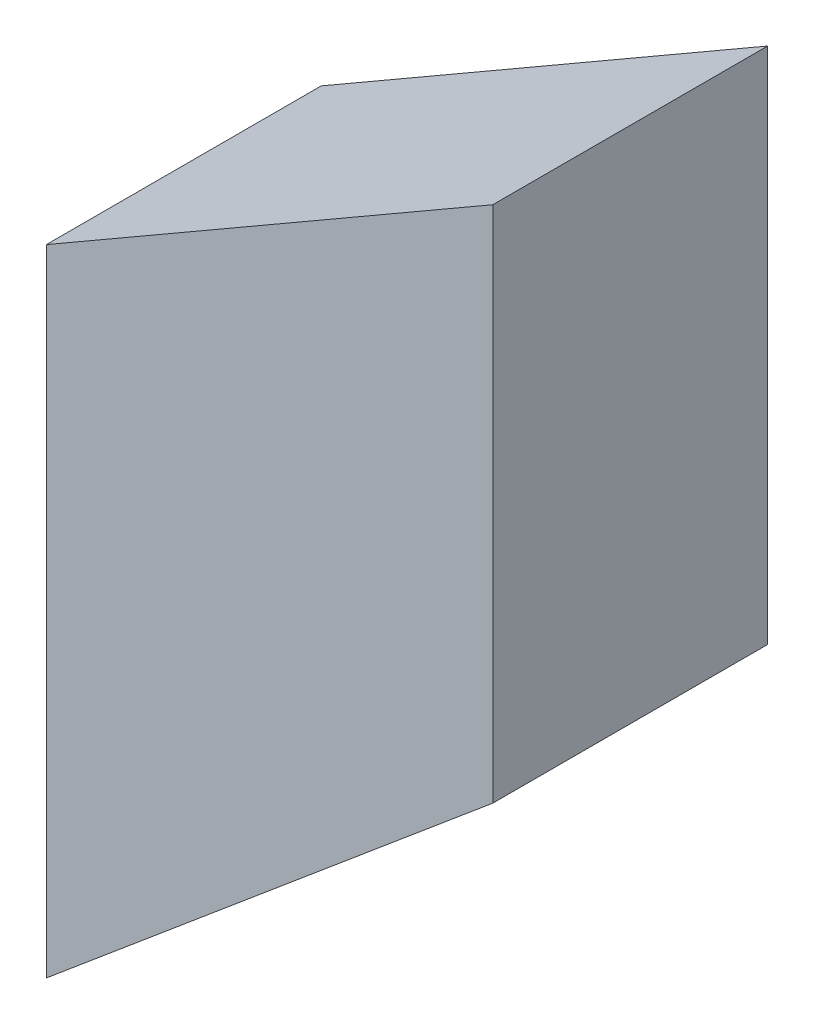
ISO-10303-21;
HEADER;
FILE_DESCRIPTION(('STEP AP214'),'2;1');
FILE_NAME('part.step','',(''),(''),'','','');
FILE_SCHEMA(('AUTOMOTIVE_DESIGN { 1 0 10303 214 1 1 1 1 }'));
ENDSEC;
DATA;
#1=APPLICATION_CONTEXT('core data for automotive mechanical design processes');
#2=APPLICATION_PROTOCOL_DEFINITION('international standard','automotive_design',2000,#1);
#3=PRODUCT_CONTEXT('',#1,'mechanical');
#4=PRODUCT('Part','Part','',(#3));
#5=PRODUCT_RELATED_PRODUCT_CATEGORY('part','',(#4));
#6=PRODUCT_DEFINITION_FORMATION('','',#4);
#7=PRODUCT_DEFINITION_CONTEXT('part definition',#1,'design');
#8=PRODUCT_DEFINITION('design','',#6,#7);
#9=PRODUCT_DEFINITION_SHAPE('','',#8);
#10=(LENGTH_UNIT() NAMED_UNIT(*) SI_UNIT(.MILLI.,.METRE.));
#11=(NAMED_UNIT(*) PLANE_ANGLE_UNIT() SI_UNIT($,.RADIAN.));
#12=(NAMED_UNIT(*) SI_UNIT($,.STERADIAN.) SOLID_ANGLE_UNIT());
#13=UNCERTAINTY_MEASURE_WITH_UNIT(LENGTH_MEASURE(1.E-05),#10,'distance_accuracy_value','');
#14=(GEOMETRIC_REPRESENTATION_CONTEXT(3) GLOBAL_UNCERTAINTY_ASSIGNED_CONTEXT((#13)) GLOBAL_UNIT_ASSIGNED_CONTEXT((#10,
#11,#12)) REPRESENTATION_CONTEXT('',''));
#15=CARTESIAN_POINT('',(0.,0.,0.));
#16=DIRECTION('',(0.,0.,1.));
#17=DIRECTION('',(1.,0.,0.));
#18=AXIS2_PLACEMENT_3D('',#15,#16,#17);
#19=CARTESIAN_POINT('',(0.,60960.,-18769.584));
#20=DIRECTION('',(-0.500000000000001,0.866025403784438,0.));
#21=DIRECTION('',(-0.866025403784438,-0.500000000000001,0.));
#22=AXIS2_PLACEMENT_3D('',#19,#20,#21);
#23=PLANE('',#22);
#24=DIRECTION('',(-0.866025403784438,-0.500000000000001,0.));
#25=VECTOR('',#24,1.);
#26=CARTESIAN_POINT('',(0.,60960.,0.));
#27=LINE('',#26,#25);
#28=CARTESIAN_POINT('',(0.,60960.,0.));
#29=VERTEX_POINT('',#28);
#30=CARTESIAN_POINT('',(-30480.,43362.3637951002,0.));
#31=VERTEX_POINT('',#30);
#32=EDGE_CURVE('E101',#29,#31,#27,.T.);
#33=ORIENTED_EDGE('',*,*,#32,.F.);
#34=DIRECTION('',(0.,0.,1.));
#35=VECTOR('',#34,1.);
#36=CARTESIAN_POINT('',(0.,60960.,-18769.584));
#37=LINE('',#36,#35);
#38=CARTESIAN_POINT('',(0.,60960.,-18769.584));
#39=VERTEX_POINT('',#38);
#40=EDGE_CURVE('E11',#39,#29,#37,.T.);
#41=ORIENTED_EDGE('',*,*,#40,.F.);
#42=DIRECTION('',(-0.866025403784438,-0.500000000000001,0.));
#43=VECTOR('',#42,1.);
#44=CARTESIAN_POINT('',(0.,60960.,-18769.584));
#45=LINE('',#44,#43);
#46=CARTESIAN_POINT('',(-30480.,43362.3637951002,-18769.584));
#47=VERTEX_POINT('',#46);
#48=EDGE_CURVE('E95',#39,#47,#45,.T.);
#49=ORIENTED_EDGE('',*,*,#48,.T.);
#50=DIRECTION('',(0.,0.,1.));
#51=VECTOR('',#50,1.);
#52=CARTESIAN_POINT('',(-30480.,43362.3637951002,-18769.584));
#53=LINE('',#52,#51);
#54=EDGE_CURVE('E40',#47,#31,#53,.T.);
#55=ORIENTED_EDGE('',*,*,#54,.T.);
#56=EDGE_LOOP('',(#33,#41,#49,#55));
#57=FACE_BOUND('',#56,.T.);
#58=ADVANCED_FACE('F37',(#57),#23,.T.);
#59=CARTESIAN_POINT('',(0.,25575.7567582832,-18769.584));
#60=DIRECTION('',(1.,0.,0.));
#61=DIRECTION('',(0.,0.,-1.));
#62=AXIS2_PLACEMENT_3D('',#59,#60,#61);
#63=PLANE('',#62);
#64=DIRECTION('',(0.,1.,0.));
#65=VECTOR('',#64,1.);
#66=CARTESIAN_POINT('',(0.,25575.7567582832,0.));
#67=LINE('',#66,#65);
#68=CARTESIAN_POINT('',(0.,25575.7567582832,0.));
#69=VERTEX_POINT('',#68);
#70=EDGE_CURVE('E97',#69,#29,#67,.T.);
#71=ORIENTED_EDGE('',*,*,#70,.F.);
#72=DIRECTION('',(0.,0.,1.));
#73=VECTOR('',#72,1.);
#74=CARTESIAN_POINT('',(0.,25575.7567582832,-18769.584));
#75=LINE('',#74,#73);
#76=CARTESIAN_POINT('',(0.,25575.7567582832,-18769.584));
#77=VERTEX_POINT('',#76);
#78=EDGE_CURVE('E46',#77,#69,#75,.T.);
#79=ORIENTED_EDGE('',*,*,#78,.F.);
#80=DIRECTION('',(0.,1.,0.));
#81=VECTOR('',#80,1.);
#82=CARTESIAN_POINT('',(0.,25575.7567582832,-18769.584));
#83=LINE('',#82,#81);
#84=EDGE_CURVE('E92',#77,#39,#83,.T.);
#85=ORIENTED_EDGE('',*,*,#84,.T.);
#86=ORIENTED_EDGE('',*,*,#40,.T.);
#87=EDGE_LOOP('',(#71,#79,#85,#86));
#88=FACE_BOUND('',#87,.T.);
#89=ADVANCED_FACE('F111',(#88),#63,.T.);
#90=CARTESIAN_POINT('',(-30480.,-3.73272344380113E-12,-18769.584));
#91=DIRECTION('',(0.642787609686535,-0.766044443118982,0.));
#92=DIRECTION('',(0.766044443118982,0.642787609686535,0.));
#93=AXIS2_PLACEMENT_3D('',#90,#91,#92);
#94=PLANE('',#93);
#95=DIRECTION('',(0.766044443118982,0.642787609686535,0.));
#96=VECTOR('',#95,1.);
#97=CARTESIAN_POINT('',(-30480.,-3.73272344380113E-12,0.));
#98=LINE('',#97,#96);
#99=CARTESIAN_POINT('',(-30480.,-3.73272344380113E-12,0.));
#100=VERTEX_POINT('',#99);
#101=EDGE_CURVE('E87',#100,#69,#98,.T.);
#102=ORIENTED_EDGE('',*,*,#101,.F.);
#103=DIRECTION('',(0.,0.,1.));
#104=VECTOR('',#103,1.);
#105=CARTESIAN_POINT('',(-30480.,-3.73272344380113E-12,-18769.584));
#106=LINE('',#105,#104);
#107=CARTESIAN_POINT('',(-30480.,-3.73272344380113E-12,-18769.584));
#108=VERTEX_POINT('',#107);
#109=EDGE_CURVE('E82',#108,#100,#106,.T.);
#110=ORIENTED_EDGE('',*,*,#109,.F.);
#111=DIRECTION('',(0.766044443118982,0.642787609686535,0.));
#112=VECTOR('',#111,1.);
#113=CARTESIAN_POINT('',(-30480.,-3.73272344380113E-12,-18769.584));
#114=LINE('',#113,#112);
#115=EDGE_CURVE('E85',#108,#77,#114,.T.);
#116=ORIENTED_EDGE('',*,*,#115,.T.);
#117=ORIENTED_EDGE('',*,*,#78,.T.);
#118=EDGE_LOOP('',(#102,#110,#116,#117));
#119=FACE_BOUND('',#118,.T.);
#120=ADVANCED_FACE('F84',(#119),#94,.T.);
#121=CARTESIAN_POINT('',(-30480.,43362.3637951002,-18769.584));
#122=DIRECTION('',(-1.,0.,0.));
#123=DIRECTION('',(0.,-1.,0.));
#124=AXIS2_PLACEMENT_3D('',#121,#122,#123);
#125=PLANE('',#124);
#126=DIRECTION('',(0.,-1.,0.));
#127=VECTOR('',#126,1.);
#128=CARTESIAN_POINT('',(-30480.,43362.3637951002,0.));
#129=LINE('',#128,#127);
#130=EDGE_CURVE('E104',#31,#100,#129,.T.);
#131=ORIENTED_EDGE('',*,*,#130,.F.);
#132=ORIENTED_EDGE('',*,*,#54,.F.);
#133=DIRECTION('',(0.,-1.,0.));
#134=VECTOR('',#133,1.);
#135=CARTESIAN_POINT('',(-30480.,43362.3637951002,-18769.584));
#136=LINE('',#135,#134);
#137=EDGE_CURVE('E91',#47,#108,#136,.T.);
#138=ORIENTED_EDGE('',*,*,#137,.T.);
#139=ORIENTED_EDGE('',*,*,#109,.T.);
#140=EDGE_LOOP('',(#131,#132,#138,#139));
#141=FACE_BOUND('',#140,.T.);
#142=ADVANCED_FACE('F94',(#141),#125,.T.);
#143=CARTESIAN_POINT('',(0.,0.,-18769.584));
#144=DIRECTION('',(0.,0.,1.));
#145=DIRECTION('',(1.,0.,0.));
#146=AXIS2_PLACEMENT_3D('',#143,#144,#145);
#147=PLANE('',#146);
#148=ORIENTED_EDGE('',*,*,#48,.F.);
#149=ORIENTED_EDGE('',*,*,#84,.F.);
#150=ORIENTED_EDGE('',*,*,#115,.F.);
#151=ORIENTED_EDGE('',*,*,#137,.F.);
#152=EDGE_LOOP('',(#148,#149,#150,#151));
#153=FACE_BOUND('',#152,.T.);
#154=ADVANCED_FACE('F90',(#153),#147,.F.);
#155=CARTESIAN_POINT('',(0.,0.,0.));
#156=DIRECTION('',(0.,0.,1.));
#157=DIRECTION('',(1.,0.,0.));
#158=AXIS2_PLACEMENT_3D('',#155,#156,#157);
#159=PLANE('',#158);
#160=ORIENTED_EDGE('',*,*,#32,.T.);
#161=ORIENTED_EDGE('',*,*,#130,.T.);
#162=ORIENTED_EDGE('',*,*,#101,.T.);
#163=ORIENTED_EDGE('',*,*,#70,.T.);
#164=EDGE_LOOP('',(#160,#161,#162,#163));
#165=FACE_BOUND('',#164,.T.);
#166=ADVANCED_FACE('F110',(#165),#159,.T.);
#167=CLOSED_SHELL('',(#58,#89,#120,#142,#154,#166));
#168=MANIFOLD_SOLID_BREP('B2',#167);
#169=ADVANCED_BREP_SHAPE_REPRESENTATION('',(#18,#168),#14);
#170=SHAPE_DEFINITION_REPRESENTATION(#9,#169);
ENDSEC;
END-ISO-10303-21;
